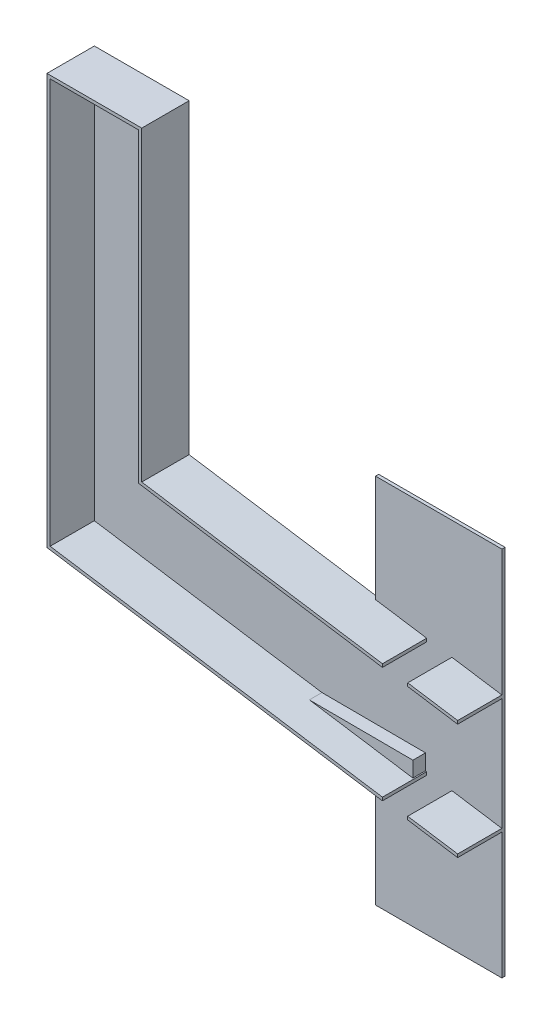
ISO-10303-21;
HEADER;
FILE_DESCRIPTION(('STEP AP214'),'2;1');
FILE_NAME('part.step','',(''),(''),'','','');
FILE_SCHEMA(('AUTOMOTIVE_DESIGN { 1 0 10303 214 1 1 1 1 }'));
ENDSEC;
DATA;
#1=APPLICATION_CONTEXT('core data for automotive mechanical design processes');
#2=APPLICATION_PROTOCOL_DEFINITION('international standard','automotive_design',2000,#1);
#3=PRODUCT_CONTEXT('',#1,'mechanical');
#4=PRODUCT('Part','Part','',(#3));
#5=PRODUCT_RELATED_PRODUCT_CATEGORY('part','',(#4));
#6=PRODUCT_DEFINITION_FORMATION('','',#4);
#7=PRODUCT_DEFINITION_CONTEXT('part definition',#1,'design');
#8=PRODUCT_DEFINITION('design','',#6,#7);
#9=PRODUCT_DEFINITION_SHAPE('','',#8);
#10=(LENGTH_UNIT() NAMED_UNIT(*) SI_UNIT(.MILLI.,.METRE.));
#11=(NAMED_UNIT(*) PLANE_ANGLE_UNIT() SI_UNIT($,.RADIAN.));
#12=(NAMED_UNIT(*) SI_UNIT($,.STERADIAN.) SOLID_ANGLE_UNIT());
#13=UNCERTAINTY_MEASURE_WITH_UNIT(LENGTH_MEASURE(1.E-05),#10,'distance_accuracy_value','');
#14=(GEOMETRIC_REPRESENTATION_CONTEXT(3) GLOBAL_UNCERTAINTY_ASSIGNED_CONTEXT((#13)) GLOBAL_UNIT_ASSIGNED_CONTEXT((#10,
#11,#12)) REPRESENTATION_CONTEXT('',''));
#15=CARTESIAN_POINT('',(0.,0.,0.));
#16=DIRECTION('',(0.,0.,1.));
#17=DIRECTION('',(1.,0.,0.));
#18=AXIS2_PLACEMENT_3D('',#15,#16,#17);
#19=CARTESIAN_POINT('',(0.,0.,5.));
#20=DIRECTION('',(0.,0.,1.));
#21=DIRECTION('',(1.,0.,0.));
#22=AXIS2_PLACEMENT_3D('',#19,#20,#21);
#23=PLANE('',#22);
#24=DIRECTION('',(0.,1.,0.));
#25=VECTOR('',#24,1.);
#26=CARTESIAN_POINT('',(105.82949898922,-15.2696962723442,5.));
#27=LINE('',#26,#25);
#28=CARTESIAN_POINT('',(105.82949898922,-10.3630488011035,5.));
#29=VERTEX_POINT('',#28);
#30=CARTESIAN_POINT('',(105.82949898922,-15.2696962723442,5.));
#31=VERTEX_POINT('',#30);
#32=EDGE_CURVE('E223',#29,#31,#27,.F.);
#33=ORIENTED_EDGE('',*,*,#32,.F.);
#34=DIRECTION('',(-0.999991329622211,0.00416421425985959,0.));
#35=VECTOR('',#34,1.);
#36=CARTESIAN_POINT('',(105.82949898922,-10.3630488011035,5.));
#37=LINE('',#36,#35);
#38=CARTESIAN_POINT('',(73.0490000969523,-10.2265425966107,5.));
#39=VERTEX_POINT('',#38);
#40=EDGE_CURVE('E230',#39,#29,#37,.F.);
#41=ORIENTED_EDGE('',*,*,#40,.F.);
#42=DIRECTION('',(-0.988371697650617,0.152057184253941,0.));
#43=VECTOR('',#42,1.);
#44=CARTESIAN_POINT('',(0.152057184253941,0.988371697650617,5.));
#45=LINE('',#44,#43);
#46=EDGE_CURVE('E243',#31,#39,#45,.T.);
#47=ORIENTED_EDGE('',*,*,#46,.F.);
#48=EDGE_LOOP('',(#33,#41,#47));
#49=FACE_BOUND('',#48,.T.);
#50=ADVANCED_FACE('F17',(#49),#23,.T.);
#51=CARTESIAN_POINT('',(114.193004161351,130.,0.));
#52=DIRECTION('',(1.,0.,0.));
#53=DIRECTION('',(0.,1.,0.));
#54=AXIS2_PLACEMENT_3D('',#51,#52,#53);
#55=PLANE('',#54);
#56=DIRECTION('',(0.,1.,0.));
#57=VECTOR('',#56,1.);
#58=CARTESIAN_POINT('',(114.193004161351,130.,1.));
#59=LINE('',#58,#57);
#60=CARTESIAN_POINT('',(114.193004161351,19.0071988301182,1.));
#61=VERTEX_POINT('',#60);
#62=CARTESIAN_POINT('',(114.193004161351,20.0189639407309,1.));
#63=VERTEX_POINT('',#62);
#64=EDGE_CURVE('E20',#61,#63,#59,.T.);
#65=ORIENTED_EDGE('',*,*,#64,.F.);
#66=DIRECTION('',(0.,0.,1.));
#67=VECTOR('',#66,1.);
#68=CARTESIAN_POINT('',(114.193004161351,19.0071988301182,15.));
#69=LINE('',#68,#67);
#70=CARTESIAN_POINT('',(114.193004161351,19.0071988301182,15.));
#71=VERTEX_POINT('',#70);
#72=EDGE_CURVE('E321',#61,#71,#69,.T.);
#73=ORIENTED_EDGE('',*,*,#72,.T.);
#74=DIRECTION('',(0.,1.,0.));
#75=VECTOR('',#74,1.);
#76=CARTESIAN_POINT('',(114.193004161351,0.,15.));
#77=LINE('',#76,#75);
#78=CARTESIAN_POINT('',(114.193004161351,20.0189639407309,15.));
#79=VERTEX_POINT('',#78);
#80=EDGE_CURVE('E257',#79,#71,#77,.F.);
#81=ORIENTED_EDGE('',*,*,#80,.F.);
#82=DIRECTION('',(0.,0.,1.));
#83=VECTOR('',#82,1.);
#84=CARTESIAN_POINT('',(114.193004161351,20.0189639407309,1.));
#85=LINE('',#84,#83);
#86=EDGE_CURVE('E277',#63,#79,#85,.T.);
#87=ORIENTED_EDGE('',*,*,#86,.F.);
#88=EDGE_LOOP('',(#65,#73,#81,#87));
#89=FACE_BOUND('',#88,.T.);
#90=ADVANCED_FACE('F278',(#89),#55,.F.);
#91=CARTESIAN_POINT('',(0.,0.,15.));
#92=DIRECTION('',(0.,0.,1.));
#93=DIRECTION('',(1.,0.,0.));
#94=AXIS2_PLACEMENT_3D('',#91,#92,#93);
#95=PLANE('',#94);
#96=DIRECTION('',(0.,1.,0.));
#97=VECTOR('',#96,1.);
#98=CARTESIAN_POINT('',(130.,0.,15.));
#99=LINE('',#98,#97);
#100=CARTESIAN_POINT('',(130.,16.5753533164798,15.));
#101=VERTEX_POINT('',#100);
#102=CARTESIAN_POINT('',(130.,17.5871184270926,15.));
#103=VERTEX_POINT('',#102);
#104=EDGE_CURVE('E256',#101,#103,#99,.T.);
#105=ORIENTED_EDGE('',*,*,#104,.T.);
#106=DIRECTION('',(-0.988371697650617,0.152057184253941,0.));
#107=VECTOR('',#106,1.);
#108=CARTESIAN_POINT('',(30.,32.9717338117079,15.));
#109=LINE('',#108,#107);
#110=EDGE_CURVE('E281',#79,#103,#109,.F.);
#111=ORIENTED_EDGE('',*,*,#110,.F.);
#112=ORIENTED_EDGE('',*,*,#80,.T.);
#113=DIRECTION('',(-0.988371697650617,0.152057184253941,0.));
#114=VECTOR('',#113,1.);
#115=CARTESIAN_POINT('',(5.49687390883511,35.7296804074282,15.));
#116=LINE('',#115,#114);
#117=EDGE_CURVE('E319',#71,#101,#116,.F.);
#118=ORIENTED_EDGE('',*,*,#117,.T.);
#119=EDGE_LOOP('',(#105,#111,#112,#118));
#120=FACE_BOUND('',#119,.T.);
#121=ADVANCED_FACE('F641',(#120),#95,.T.);
#122=CARTESIAN_POINT('',(114.193004161351,130.,0.));
#123=DIRECTION('',(1.,0.,0.));
#124=DIRECTION('',(0.,1.,0.));
#125=AXIS2_PLACEMENT_3D('',#122,#123,#124);
#126=PLANE('',#125);
#127=DIRECTION('',(0.,0.,1.));
#128=VECTOR('',#127,1.);
#129=CARTESIAN_POINT('',(114.193004161351,-16.5563893757489,15.));
#130=LINE('',#129,#128);
#131=CARTESIAN_POINT('',(114.193004161351,-16.5563893757489,1.));
#132=VERTEX_POINT('',#131);
#133=CARTESIAN_POINT('',(114.193004161351,-16.5563893757489,15.));
#134=VERTEX_POINT('',#133);
#135=EDGE_CURVE('E317',#132,#134,#130,.T.);
#136=ORIENTED_EDGE('',*,*,#135,.F.);
#137=DIRECTION('',(0.,1.,0.));
#138=VECTOR('',#137,1.);
#139=CARTESIAN_POINT('',(114.193004161351,130.,1.));
#140=LINE('',#139,#138);
#141=CARTESIAN_POINT('',(114.193004161351,-17.5681544863616,1.));
#142=VERTEX_POINT('',#141);
#143=EDGE_CURVE('E254',#142,#132,#140,.T.);
#144=ORIENTED_EDGE('',*,*,#143,.F.);
#145=DIRECTION('',(0.,0.,1.));
#146=VECTOR('',#145,1.);
#147=CARTESIAN_POINT('',(114.193004161351,-17.5681544863616,1.));
#148=LINE('',#147,#146);
#149=CARTESIAN_POINT('',(114.193004161351,-17.5681544863616,15.));
#150=VERTEX_POINT('',#149);
#151=EDGE_CURVE('E311',#142,#150,#148,.T.);
#152=ORIENTED_EDGE('',*,*,#151,.T.);
#153=DIRECTION('',(0.,1.,0.));
#154=VECTOR('',#153,1.);
#155=CARTESIAN_POINT('',(114.193004161351,0.,15.));
#156=LINE('',#155,#154);
#157=EDGE_CURVE('E252',#134,#150,#156,.F.);
#158=ORIENTED_EDGE('',*,*,#157,.F.);
#159=EDGE_LOOP('',(#136,#144,#152,#158));
#160=FACE_BOUND('',#159,.T.);
#161=ADVANCED_FACE('F637',(#160),#126,.F.);
#162=CARTESIAN_POINT('',(0.,0.,15.));
#163=DIRECTION('',(0.,0.,1.));
#164=DIRECTION('',(1.,0.,0.));
#165=AXIS2_PLACEMENT_3D('',#162,#163,#164);
#166=PLANE('',#165);
#167=DIRECTION('',(0.,1.,0.));
#168=VECTOR('',#167,1.);
#169=CARTESIAN_POINT('',(130.,0.,15.));
#170=LINE('',#169,#168);
#171=CARTESIAN_POINT('',(130.,-20.,15.));
#172=VERTEX_POINT('',#171);
#173=CARTESIAN_POINT('',(130.,-18.9882348893872,15.));
#174=VERTEX_POINT('',#173);
#175=EDGE_CURVE('E238',#172,#174,#170,.T.);
#176=ORIENTED_EDGE('',*,*,#175,.T.);
#177=DIRECTION('',(-0.988371697650617,0.152057184253941,0.));
#178=VECTOR('',#177,1.);
#179=CARTESIAN_POINT('',(0.152057184253941,0.988371697650617,15.));
#180=LINE('',#179,#178);
#181=EDGE_CURVE('E314',#134,#174,#180,.F.);
#182=ORIENTED_EDGE('',*,*,#181,.F.);
#183=ORIENTED_EDGE('',*,*,#157,.T.);
#184=DIRECTION('',(-0.988371697650617,0.152057184253941,0.));
#185=VECTOR('',#184,1.);
#186=CARTESIAN_POINT('',(0.,0.,15.));
#187=LINE('',#186,#185);
#188=EDGE_CURVE('E308',#150,#172,#187,.F.);
#189=ORIENTED_EDGE('',*,*,#188,.T.);
#190=EDGE_LOOP('',(#176,#182,#183,#189));
#191=FACE_BOUND('',#190,.T.);
#192=ADVANCED_FACE('F634',(#191),#166,.T.);
#193=CARTESIAN_POINT('',(105.82949898922,-10.3630488011035,-5.));
#194=DIRECTION('',(0.00416421425985959,0.999991329622211,0.));
#195=DIRECTION('',(-0.999991329622211,0.00416421425985959,0.));
#196=AXIS2_PLACEMENT_3D('',#193,#194,#195);
#197=PLANE('',#196);
#198=DIRECTION('',(0.,0.,-1.));
#199=VECTOR('',#198,1.);
#200=CARTESIAN_POINT('',(105.82949898922,-10.3630488011035,-5.));
#201=LINE('',#200,#199);
#202=CARTESIAN_POINT('',(105.82949898922,-10.3630488011035,1.));
#203=VERTEX_POINT('',#202);
#204=EDGE_CURVE('E233',#203,#29,#201,.F.);
#205=ORIENTED_EDGE('',*,*,#204,.F.);
#206=DIRECTION('',(0.999991329622211,-0.00416421425985969,0.));
#207=VECTOR('',#206,1.);
#208=CARTESIAN_POINT('',(73.0490000969521,-10.2265425966106,1.));
#209=LINE('',#208,#207);
#210=CARTESIAN_POINT('',(73.049000096952,-10.2265425966106,1.));
#211=VERTEX_POINT('',#210);
#212=EDGE_CURVE('E306',#211,#203,#209,.T.);
#213=ORIENTED_EDGE('',*,*,#212,.F.);
#214=DIRECTION('',(0.,0.,1.));
#215=VECTOR('',#214,1.);
#216=CARTESIAN_POINT('',(73.0490000969521,-10.2265425966106,15.));
#217=LINE('',#216,#215);
#218=EDGE_CURVE('E235',#39,#211,#217,.F.);
#219=ORIENTED_EDGE('',*,*,#218,.F.);
#220=ORIENTED_EDGE('',*,*,#40,.T.);
#221=EDGE_LOOP('',(#205,#213,#219,#220));
#222=FACE_BOUND('',#221,.T.);
#223=ADVANCED_FACE('F231',(#222),#197,.T.);
#224=CARTESIAN_POINT('',(105.82949898922,-15.2696962723442,-5.));
#225=DIRECTION('',(1.,0.,0.));
#226=DIRECTION('',(0.,0.,-1.));
#227=AXIS2_PLACEMENT_3D('',#224,#225,#226);
#228=PLANE('',#227);
#229=DIRECTION('',(0.,0.,1.));
#230=VECTOR('',#229,1.);
#231=CARTESIAN_POINT('',(105.82949898922,-15.2696962723442,15.));
#232=LINE('',#231,#230);
#233=CARTESIAN_POINT('',(105.82949898922,-15.2696962723442,0.999999999999999));
#234=VERTEX_POINT('',#233);
#235=EDGE_CURVE('E349',#234,#31,#232,.T.);
#236=ORIENTED_EDGE('',*,*,#235,.F.);
#237=DIRECTION('',(0.,1.,0.));
#238=VECTOR('',#237,1.);
#239=CARTESIAN_POINT('',(105.82949898922,0.,1.));
#240=LINE('',#239,#238);
#241=EDGE_CURVE('E241',#203,#234,#240,.F.);
#242=ORIENTED_EDGE('',*,*,#241,.F.);
#243=ORIENTED_EDGE('',*,*,#204,.T.);
#244=ORIENTED_EDGE('',*,*,#32,.T.);
#245=EDGE_LOOP('',(#236,#242,#243,#244));
#246=FACE_BOUND('',#245,.T.);
#247=ADVANCED_FACE('F240',(#246),#228,.T.);
#248=CARTESIAN_POINT('',(5.49687390883511,35.7296804074282,15.));
#249=DIRECTION('',(0.152057184253941,0.988371697650617,0.));
#250=DIRECTION('',(-0.988371697650617,0.152057184253941,0.));
#251=AXIS2_PLACEMENT_3D('',#248,#249,#250);
#252=PLANE('',#251);
#253=DIRECTION('',(0.988371697650617,-0.152057184253941,0.));
#254=VECTOR('',#253,1.);
#255=CARTESIAN_POINT('',(29.,32.1138148549413,15.));
#256=LINE('',#255,#254);
#257=CARTESIAN_POINT('',(29.,32.1138148549413,15.));
#258=VERTEX_POINT('',#257);
#259=CARTESIAN_POINT('',(106.193004161351,20.2379680608874,15.));
#260=VERTEX_POINT('',#259);
#261=EDGE_CURVE('E329',#258,#260,#256,.T.);
#262=ORIENTED_EDGE('',*,*,#261,.F.);
#263=DIRECTION('',(0.,0.,1.));
#264=VECTOR('',#263,1.);
#265=CARTESIAN_POINT('',(29.,32.1138148549413,15.));
#266=LINE('',#265,#264);
#267=CARTESIAN_POINT('',(29.,32.1138148549413,0.999999999999998));
#268=VERTEX_POINT('',#267);
#269=EDGE_CURVE('E244',#258,#268,#266,.F.);
#270=ORIENTED_EDGE('',*,*,#269,.T.);
#271=DIRECTION('',(-0.988371697650617,0.152057184253941,0.));
#272=VECTOR('',#271,1.);
#273=CARTESIAN_POINT('',(106.193004161351,20.2379680608874,1.));
#274=LINE('',#273,#272);
#275=CARTESIAN_POINT('',(106.193004161351,20.2379680608874,0.999999999999997));
#276=VERTEX_POINT('',#275);
#277=EDGE_CURVE('E291',#276,#268,#274,.T.);
#278=ORIENTED_EDGE('',*,*,#277,.F.);
#279=DIRECTION('',(0.,0.,1.));
#280=VECTOR('',#279,1.);
#281=CARTESIAN_POINT('',(106.193004161351,20.2379680608874,0.));
#282=LINE('',#281,#280);
#283=EDGE_CURVE('E343',#260,#276,#282,.F.);
#284=ORIENTED_EDGE('',*,*,#283,.F.);
#285=EDGE_LOOP('',(#262,#270,#278,#284));
#286=FACE_BOUND('',#285,.T.);
#287=ADVANCED_FACE('F377',(#286),#252,.F.);
#288=CARTESIAN_POINT('',(29.,0.,15.));
#289=DIRECTION('',(1.,0.,0.));
#290=DIRECTION('',(0.,1.,0.));
#291=AXIS2_PLACEMENT_3D('',#288,#289,#290);
#292=PLANE('',#291);
#293=ORIENTED_EDGE('',*,*,#269,.F.);
#294=DIRECTION('',(0.,1.,0.));
#295=VECTOR('',#294,1.);
#296=CARTESIAN_POINT('',(29.,0.,15.));
#297=LINE('',#296,#295);
#298=CARTESIAN_POINT('',(29.,129.,15.));
#299=VERTEX_POINT('',#298);
#300=EDGE_CURVE('E331',#299,#258,#297,.F.);
#301=ORIENTED_EDGE('',*,*,#300,.F.);
#302=DIRECTION('',(0.,0.,1.));
#303=VECTOR('',#302,1.);
#304=CARTESIAN_POINT('',(29.,129.,15.));
#305=LINE('',#304,#303);
#306=CARTESIAN_POINT('',(29.,129.,1.));
#307=VERTEX_POINT('',#306);
#308=EDGE_CURVE('E247',#299,#307,#305,.F.);
#309=ORIENTED_EDGE('',*,*,#308,.T.);
#310=DIRECTION('',(0.,1.,0.));
#311=VECTOR('',#310,1.);
#312=CARTESIAN_POINT('',(29.,0.,1.));
#313=LINE('',#312,#311);
#314=EDGE_CURVE('E359',#268,#307,#313,.T.);
#315=ORIENTED_EDGE('',*,*,#314,.F.);
#316=EDGE_LOOP('',(#293,#301,#309,#315));
#317=FACE_BOUND('',#316,.T.);
#318=ADVANCED_FACE('F358',(#317),#292,.F.);
#319=CARTESIAN_POINT('',(0.,129.,15.));
#320=DIRECTION('',(0.,1.,0.));
#321=DIRECTION('',(0.,0.,1.));
#322=AXIS2_PLACEMENT_3D('',#319,#320,#321);
#323=PLANE('',#322);
#324=ORIENTED_EDGE('',*,*,#308,.F.);
#325=DIRECTION('',(1.,0.,0.));
#326=VECTOR('',#325,1.);
#327=CARTESIAN_POINT('',(0.,129.,15.));
#328=LINE('',#327,#326);
#329=CARTESIAN_POINT('',(1.,129.,15.));
#330=VERTEX_POINT('',#329);
#331=EDGE_CURVE('E334',#330,#299,#328,.T.);
#332=ORIENTED_EDGE('',*,*,#331,.F.);
#333=DIRECTION('',(0.,0.,1.));
#334=VECTOR('',#333,1.);
#335=CARTESIAN_POINT('',(1.,129.,15.));
#336=LINE('',#335,#334);
#337=CARTESIAN_POINT('',(1.,129.,1.));
#338=VERTEX_POINT('',#337);
#339=EDGE_CURVE('E351',#330,#338,#336,.F.);
#340=ORIENTED_EDGE('',*,*,#339,.T.);
#341=DIRECTION('',(1.,0.,0.));
#342=VECTOR('',#341,1.);
#343=CARTESIAN_POINT('',(0.,129.,1.));
#344=LINE('',#343,#342);
#345=EDGE_CURVE('E362',#307,#338,#344,.F.);
#346=ORIENTED_EDGE('',*,*,#345,.F.);
#347=EDGE_LOOP('',(#324,#332,#340,#346));
#348=FACE_BOUND('',#347,.T.);
#349=ADVANCED_FACE('F363',(#348),#323,.F.);
#350=CARTESIAN_POINT('',(1.,0.,15.));
#351=DIRECTION('',(-1.,0.,0.));
#352=DIRECTION('',(0.,0.,1.));
#353=AXIS2_PLACEMENT_3D('',#350,#351,#352);
#354=PLANE('',#353);
#355=ORIENTED_EDGE('',*,*,#339,.F.);
#356=DIRECTION('',(0.,1.,0.));
#357=VECTOR('',#356,1.);
#358=CARTESIAN_POINT('',(1.,0.,15.));
#359=LINE('',#358,#357);
#360=CARTESIAN_POINT('',(1.,0.857918956766607,15.));
#361=VERTEX_POINT('',#360);
#362=EDGE_CURVE('E337',#361,#330,#359,.T.);
#363=ORIENTED_EDGE('',*,*,#362,.F.);
#364=DIRECTION('',(0.,0.,1.));
#365=VECTOR('',#364,1.);
#366=CARTESIAN_POINT('',(1.,0.857918956766607,15.));
#367=LINE('',#366,#365);
#368=CARTESIAN_POINT('',(1.,0.857918956766607,1.));
#369=VERTEX_POINT('',#368);
#370=EDGE_CURVE('E345',#369,#361,#367,.T.);
#371=ORIENTED_EDGE('',*,*,#370,.F.);
#372=DIRECTION('',(0.,1.,0.));
#373=VECTOR('',#372,1.);
#374=CARTESIAN_POINT('',(1.,0.,1.));
#375=LINE('',#374,#373);
#376=EDGE_CURVE('E365',#338,#369,#375,.F.);
#377=ORIENTED_EDGE('',*,*,#376,.F.);
#378=EDGE_LOOP('',(#355,#363,#371,#377));
#379=FACE_BOUND('',#378,.T.);
#380=ADVANCED_FACE('F385',(#379),#354,.F.);
#381=CARTESIAN_POINT('',(0.152057184253941,0.988371697650617,15.));
#382=DIRECTION('',(0.152057184253941,0.988371697650617,0.));
#383=DIRECTION('',(-0.988371697650617,0.152057184253941,0.));
#384=AXIS2_PLACEMENT_3D('',#381,#382,#383);
#385=PLANE('',#384);
#386=DIRECTION('',(0.,0.,1.));
#387=VECTOR('',#386,1.);
#388=CARTESIAN_POINT('',(106.193004161351,-15.3256201449796,0.));
#389=LINE('',#388,#387);
#390=CARTESIAN_POINT('',(106.193004161351,-15.3256201449796,0.999999999999997));
#391=VERTEX_POINT('',#390);
#392=CARTESIAN_POINT('',(106.193004161351,-15.3256201449796,15.));
#393=VERTEX_POINT('',#392);
#394=EDGE_CURVE('E325',#391,#393,#389,.T.);
#395=ORIENTED_EDGE('',*,*,#394,.F.);
#396=DIRECTION('',(0.988371697650621,-0.152057184253913,0.));
#397=VECTOR('',#396,1.);
#398=CARTESIAN_POINT('',(105.82949898922,-15.2696962723442,1.));
#399=LINE('',#398,#397);
#400=EDGE_CURVE('E303',#234,#391,#399,.T.);
#401=ORIENTED_EDGE('',*,*,#400,.F.);
#402=ORIENTED_EDGE('',*,*,#235,.T.);
#403=ORIENTED_EDGE('',*,*,#46,.T.);
#404=ORIENTED_EDGE('',*,*,#218,.T.);
#405=DIRECTION('',(0.988371697650617,-0.152057184253941,0.));
#406=VECTOR('',#405,1.);
#407=CARTESIAN_POINT('',(1.,0.857918956766607,1.));
#408=LINE('',#407,#406);
#409=EDGE_CURVE('E367',#369,#211,#408,.T.);
#410=ORIENTED_EDGE('',*,*,#409,.F.);
#411=ORIENTED_EDGE('',*,*,#370,.T.);
#412=DIRECTION('',(-0.988371697650617,0.152057184253941,0.));
#413=VECTOR('',#412,1.);
#414=CARTESIAN_POINT('',(106.193004161351,-15.3256201449796,15.));
#415=LINE('',#414,#413);
#416=EDGE_CURVE('E340',#393,#361,#415,.T.);
#417=ORIENTED_EDGE('',*,*,#416,.F.);
#418=EDGE_LOOP('',(#395,#401,#402,#403,#404,#410,#411,#417));
#419=FACE_BOUND('',#418,.T.);
#420=ADVANCED_FACE('F618',(#419),#385,.T.);
#421=CARTESIAN_POINT('',(0.,0.,-5.));
#422=DIRECTION('',(0.,0.,1.));
#423=DIRECTION('',(1.,0.,0.));
#424=AXIS2_PLACEMENT_3D('',#421,#422,#423);
#425=PLANE('',#424);
#426=DIRECTION('',(-0.999991329622211,0.00416421425985959,0.));
#427=VECTOR('',#426,1.);
#428=CARTESIAN_POINT('',(105.82949898922,-10.3630488011035,-5.));
#429=LINE('',#428,#427);
#430=CARTESIAN_POINT('',(105.82949898922,-10.3630488011035,-5.));
#431=VERTEX_POINT('',#430);
#432=CARTESIAN_POINT('',(73.0490000969522,-10.2265425966106,-5.));
#433=VERTEX_POINT('',#432);
#434=EDGE_CURVE('E399',#431,#433,#429,.T.);
#435=ORIENTED_EDGE('',*,*,#434,.F.);
#436=DIRECTION('',(0.,1.,0.));
#437=VECTOR('',#436,1.);
#438=CARTESIAN_POINT('',(105.82949898922,-15.2696962723442,-5.));
#439=LINE('',#438,#437);
#440=CARTESIAN_POINT('',(105.82949898922,-15.2696962723442,-5.));
#441=VERTEX_POINT('',#440);
#442=EDGE_CURVE('E389',#441,#431,#439,.T.);
#443=ORIENTED_EDGE('',*,*,#442,.F.);
#444=DIRECTION('',(0.988371697650617,-0.152057184253941,0.));
#445=VECTOR('',#444,1.);
#446=CARTESIAN_POINT('',(73.0490000969521,-10.2265425966106,-5.));
#447=LINE('',#446,#445);
#448=EDGE_CURVE('E390',#433,#441,#447,.T.);
#449=ORIENTED_EDGE('',*,*,#448,.F.);
#450=EDGE_LOOP('',(#435,#443,#449));
#451=FACE_BOUND('',#450,.T.);
#452=ADVANCED_FACE('F614',(#451),#425,.F.);
#453=CARTESIAN_POINT('',(106.193004161351,130.,0.));
#454=DIRECTION('',(1.,0.,0.));
#455=DIRECTION('',(0.,1.,0.));
#456=AXIS2_PLACEMENT_3D('',#453,#454,#455);
#457=PLANE('',#456);
#458=DIRECTION('',(0.,1.,0.));
#459=VECTOR('',#458,1.);
#460=CARTESIAN_POINT('',(106.193004161351,0.,1.));
#461=LINE('',#460,#459);
#462=CARTESIAN_POINT('',(106.193004161351,21.2497331715002,0.999999999999997));
#463=VERTEX_POINT('',#462);
#464=EDGE_CURVE('E288',#463,#276,#461,.F.);
#465=ORIENTED_EDGE('',*,*,#464,.F.);
#466=DIRECTION('',(0.,0.,1.));
#467=VECTOR('',#466,1.);
#468=CARTESIAN_POINT('',(106.193004161351,21.2497331715002,1.));
#469=LINE('',#468,#467);
#470=CARTESIAN_POINT('',(106.193004161351,21.2497331715002,15.));
#471=VERTEX_POINT('',#470);
#472=EDGE_CURVE('E414',#471,#463,#469,.F.);
#473=ORIENTED_EDGE('',*,*,#472,.F.);
#474=DIRECTION('',(0.,1.,0.));
#475=VECTOR('',#474,1.);
#476=CARTESIAN_POINT('',(106.193004161351,0.,15.));
#477=LINE('',#476,#475);
#478=EDGE_CURVE('E327',#260,#471,#477,.T.);
#479=ORIENTED_EDGE('',*,*,#478,.F.);
#480=ORIENTED_EDGE('',*,*,#283,.T.);
#481=EDGE_LOOP('',(#465,#473,#479,#480));
#482=FACE_BOUND('',#481,.T.);
#483=ADVANCED_FACE('F611',(#482),#457,.T.);
#484=CARTESIAN_POINT('',(0.,0.,15.));
#485=DIRECTION('',(0.,0.,1.));
#486=DIRECTION('',(1.,0.,0.));
#487=AXIS2_PLACEMENT_3D('',#484,#485,#486);
#488=PLANE('',#487);
#489=DIRECTION('',(0.,1.,0.));
#490=VECTOR('',#489,1.);
#491=CARTESIAN_POINT('',(0.,0.,15.));
#492=LINE('',#491,#490);
#493=CARTESIAN_POINT('',(0.,0.,15.));
#494=VERTEX_POINT('',#493);
#495=CARTESIAN_POINT('',(0.,130.,15.));
#496=VERTEX_POINT('',#495);
#497=EDGE_CURVE('E428',#494,#496,#492,.T.);
#498=ORIENTED_EDGE('',*,*,#497,.F.);
#499=DIRECTION('',(-0.988371697650617,0.152057184253941,0.));
#500=VECTOR('',#499,1.);
#501=CARTESIAN_POINT('',(0.,0.,15.));
#502=LINE('',#501,#500);
#503=CARTESIAN_POINT('',(106.193004161351,-16.3373852555924,15.));
#504=VERTEX_POINT('',#503);
#505=EDGE_CURVE('E438',#494,#504,#502,.F.);
#506=ORIENTED_EDGE('',*,*,#505,.T.);
#507=DIRECTION('',(0.,1.,0.));
#508=VECTOR('',#507,1.);
#509=CARTESIAN_POINT('',(106.193004161351,130.,15.));
#510=LINE('',#509,#508);
#511=EDGE_CURVE('E282',#393,#504,#510,.F.);
#512=ORIENTED_EDGE('',*,*,#511,.F.);
#513=ORIENTED_EDGE('',*,*,#416,.T.);
#514=ORIENTED_EDGE('',*,*,#362,.T.);
#515=ORIENTED_EDGE('',*,*,#331,.T.);
#516=ORIENTED_EDGE('',*,*,#300,.T.);
#517=ORIENTED_EDGE('',*,*,#261,.T.);
#518=ORIENTED_EDGE('',*,*,#478,.T.);
#519=DIRECTION('',(-0.988371697650617,0.152057184253941,0.));
#520=VECTOR('',#519,1.);
#521=CARTESIAN_POINT('',(30.,32.9717338117079,15.));
#522=LINE('',#521,#520);
#523=CARTESIAN_POINT('',(30.,32.9717338117079,15.));
#524=VERTEX_POINT('',#523);
#525=EDGE_CURVE('E411',#524,#471,#522,.F.);
#526=ORIENTED_EDGE('',*,*,#525,.F.);
#527=DIRECTION('',(0.,1.,0.));
#528=VECTOR('',#527,1.);
#529=CARTESIAN_POINT('',(30.,130.,15.));
#530=LINE('',#529,#528);
#531=CARTESIAN_POINT('',(30.,130.,15.));
#532=VERTEX_POINT('',#531);
#533=EDGE_CURVE('E420',#532,#524,#530,.F.);
#534=ORIENTED_EDGE('',*,*,#533,.F.);
#535=DIRECTION('',(1.,0.,0.));
#536=VECTOR('',#535,1.);
#537=CARTESIAN_POINT('',(0.,130.,15.));
#538=LINE('',#537,#536);
#539=EDGE_CURVE('E424',#496,#532,#538,.T.);
#540=ORIENTED_EDGE('',*,*,#539,.F.);
#541=EDGE_LOOP('',(#498,#506,#512,#513,#514,#515,#516,#517,#518,#526,#534,#540));
#542=FACE_BOUND('',#541,.T.);
#543=ADVANCED_FACE('F379',(#542),#488,.T.);
#544=CARTESIAN_POINT('',(106.193004161351,130.,0.));
#545=DIRECTION('',(1.,0.,0.));
#546=DIRECTION('',(0.,1.,0.));
#547=AXIS2_PLACEMENT_3D('',#544,#545,#546);
#548=PLANE('',#547);
#549=ORIENTED_EDGE('',*,*,#394,.T.);
#550=ORIENTED_EDGE('',*,*,#511,.T.);
#551=DIRECTION('',(0.,0.,1.));
#552=VECTOR('',#551,1.);
#553=CARTESIAN_POINT('',(106.193004161351,-16.3373852555924,1.));
#554=LINE('',#553,#552);
#555=CARTESIAN_POINT('',(106.193004161351,-16.3373852555924,0.999999999999998));
#556=VERTEX_POINT('',#555);
#557=EDGE_CURVE('E441',#504,#556,#554,.F.);
#558=ORIENTED_EDGE('',*,*,#557,.T.);
#559=DIRECTION('',(0.,1.,0.));
#560=VECTOR('',#559,1.);
#561=CARTESIAN_POINT('',(106.193004161351,0.,1.));
#562=LINE('',#561,#560);
#563=EDGE_CURVE('E301',#391,#556,#562,.F.);
#564=ORIENTED_EDGE('',*,*,#563,.F.);
#565=EDGE_LOOP('',(#549,#550,#558,#564));
#566=FACE_BOUND('',#565,.T.);
#567=ADVANCED_FACE('F605',(#566),#548,.T.);
#568=CARTESIAN_POINT('',(30.,32.9717338117079,1.));
#569=DIRECTION('',(0.152057184253941,0.988371697650617,0.));
#570=DIRECTION('',(-0.988371697650617,0.152057184253941,0.));
#571=AXIS2_PLACEMENT_3D('',#568,#569,#570);
#572=PLANE('',#571);
#573=DIRECTION('',(0.,0.,-1.));
#574=VECTOR('',#573,1.);
#575=CARTESIAN_POINT('',(130.,17.5871184270926,1.));
#576=LINE('',#575,#574);
#577=CARTESIAN_POINT('',(130.,17.5871184270926,1.));
#578=VERTEX_POINT('',#577);
#579=EDGE_CURVE('E287',#578,#103,#576,.F.);
#580=ORIENTED_EDGE('',*,*,#579,.F.);
#581=DIRECTION('',(0.988371697650617,-0.152057184253942,0.));
#582=VECTOR('',#581,1.);
#583=CARTESIAN_POINT('',(114.193004161351,20.0189639407309,1.));
#584=LINE('',#583,#582);
#585=EDGE_CURVE('E269',#63,#578,#584,.T.);
#586=ORIENTED_EDGE('',*,*,#585,.F.);
#587=ORIENTED_EDGE('',*,*,#86,.T.);
#588=ORIENTED_EDGE('',*,*,#110,.T.);
#589=EDGE_LOOP('',(#580,#586,#587,#588));
#590=FACE_BOUND('',#589,.T.);
#591=ADVANCED_FACE('F285',(#590),#572,.T.);
#592=CARTESIAN_POINT('',(5.49687390883511,35.7296804074282,15.));
#593=DIRECTION('',(0.152057184253941,0.988371697650617,0.));
#594=DIRECTION('',(-0.988371697650617,0.152057184253941,0.));
#595=AXIS2_PLACEMENT_3D('',#592,#593,#594);
#596=PLANE('',#595);
#597=ORIENTED_EDGE('',*,*,#72,.F.);
#598=DIRECTION('',(-0.988371697650617,0.152057184253941,0.));
#599=VECTOR('',#598,1.);
#600=CARTESIAN_POINT('',(130.,16.5753533164798,1.));
#601=LINE('',#600,#599);
#602=CARTESIAN_POINT('',(130.,16.5753533164798,1.));
#603=VERTEX_POINT('',#602);
#604=EDGE_CURVE('E273',#603,#61,#601,.T.);
#605=ORIENTED_EDGE('',*,*,#604,.F.);
#606=DIRECTION('',(0.,0.,-1.));
#607=VECTOR('',#606,1.);
#608=CARTESIAN_POINT('',(130.,16.5753533164798,1.));
#609=LINE('',#608,#607);
#610=EDGE_CURVE('E455',#101,#603,#609,.T.);
#611=ORIENTED_EDGE('',*,*,#610,.F.);
#612=ORIENTED_EDGE('',*,*,#117,.F.);
#613=EDGE_LOOP('',(#597,#605,#611,#612));
#614=FACE_BOUND('',#613,.T.);
#615=ADVANCED_FACE('F598',(#614),#596,.F.);
#616=CARTESIAN_POINT('',(0.152057184253941,0.988371697650617,15.));
#617=DIRECTION('',(0.152057184253941,0.988371697650617,0.));
#618=DIRECTION('',(-0.988371697650617,0.152057184253941,0.));
#619=AXIS2_PLACEMENT_3D('',#616,#617,#618);
#620=PLANE('',#619);
#621=DIRECTION('',(0.,0.,-1.));
#622=VECTOR('',#621,1.);
#623=CARTESIAN_POINT('',(130.,-18.9882348893872,1.));
#624=LINE('',#623,#622);
#625=CARTESIAN_POINT('',(130.,-18.9882348893872,1.));
#626=VERTEX_POINT('',#625);
#627=EDGE_CURVE('E460',#626,#174,#624,.F.);
#628=ORIENTED_EDGE('',*,*,#627,.F.);
#629=DIRECTION('',(0.988371697650617,-0.152057184253942,0.));
#630=VECTOR('',#629,1.);
#631=CARTESIAN_POINT('',(114.193004161351,-16.5563893757489,1.));
#632=LINE('',#631,#630);
#633=EDGE_CURVE('E293',#132,#626,#632,.T.);
#634=ORIENTED_EDGE('',*,*,#633,.F.);
#635=ORIENTED_EDGE('',*,*,#135,.T.);
#636=ORIENTED_EDGE('',*,*,#181,.T.);
#637=EDGE_LOOP('',(#628,#634,#635,#636));
#638=FACE_BOUND('',#637,.T.);
#639=ADVANCED_FACE('F594',(#638),#620,.T.);
#640=CARTESIAN_POINT('',(0.,0.,1.));
#641=DIRECTION('',(0.152057184253941,0.988371697650617,0.));
#642=DIRECTION('',(-0.988371697650617,0.152057184253941,0.));
#643=AXIS2_PLACEMENT_3D('',#640,#641,#642);
#644=PLANE('',#643);
#645=ORIENTED_EDGE('',*,*,#151,.F.);
#646=DIRECTION('',(-0.988371697650617,0.152057184253941,0.));
#647=VECTOR('',#646,1.);
#648=CARTESIAN_POINT('',(130.,-20.,1.));
#649=LINE('',#648,#647);
#650=CARTESIAN_POINT('',(130.,-20.,1.));
#651=VERTEX_POINT('',#650);
#652=EDGE_CURVE('E298',#651,#142,#649,.T.);
#653=ORIENTED_EDGE('',*,*,#652,.F.);
#654=DIRECTION('',(0.,0.,-1.));
#655=VECTOR('',#654,1.);
#656=CARTESIAN_POINT('',(130.,-20.,1.));
#657=LINE('',#656,#655);
#658=EDGE_CURVE('E463',#172,#651,#657,.T.);
#659=ORIENTED_EDGE('',*,*,#658,.F.);
#660=ORIENTED_EDGE('',*,*,#188,.F.);
#661=EDGE_LOOP('',(#645,#653,#659,#660));
#662=FACE_BOUND('',#661,.T.);
#663=ADVANCED_FACE('F591',(#662),#644,.F.);
#664=CARTESIAN_POINT('',(0.,0.,1.));
#665=DIRECTION('',(0.,0.,1.));
#666=DIRECTION('',(1.,0.,0.));
#667=AXIS2_PLACEMENT_3D('',#664,#665,#666);
#668=PLANE('',#667);
#669=ORIENTED_EDGE('',*,*,#376,.T.);
#670=ORIENTED_EDGE('',*,*,#409,.T.);
#671=ORIENTED_EDGE('',*,*,#212,.T.);
#672=ORIENTED_EDGE('',*,*,#241,.T.);
#673=ORIENTED_EDGE('',*,*,#400,.T.);
#674=ORIENTED_EDGE('',*,*,#563,.T.);
#675=DIRECTION('',(-0.988371697650617,0.152057184253941,0.));
#676=VECTOR('',#675,1.);
#677=CARTESIAN_POINT('',(0.,0.,0.999999999999996));
#678=LINE('',#677,#676);
#679=CARTESIAN_POINT('',(90.,-13.8461538461538,0.999999999999999));
#680=VERTEX_POINT('',#679);
#681=EDGE_CURVE('E432',#556,#680,#678,.T.);
#682=ORIENTED_EDGE('',*,*,#681,.T.);
#683=DIRECTION('',(0.,1.,0.));
#684=VECTOR('',#683,1.);
#685=CARTESIAN_POINT('',(90.,0.,1.));
#686=LINE('',#685,#684);
#687=CARTESIAN_POINT('',(90.,-60.,1.));
#688=VERTEX_POINT('',#687);
#689=EDGE_CURVE('E444',#688,#680,#686,.T.);
#690=ORIENTED_EDGE('',*,*,#689,.F.);
#691=DIRECTION('',(1.,0.,0.));
#692=VECTOR('',#691,1.);
#693=CARTESIAN_POINT('',(0.,-60.,1.));
#694=LINE('',#693,#692);
#695=CARTESIAN_POINT('',(130.,-60.,1.));
#696=VERTEX_POINT('',#695);
#697=EDGE_CURVE('E448',#696,#688,#694,.F.);
#698=ORIENTED_EDGE('',*,*,#697,.F.);
#699=DIRECTION('',(0.,1.,0.));
#700=VECTOR('',#699,1.);
#701=CARTESIAN_POINT('',(130.,0.,1.));
#702=LINE('',#701,#700);
#703=EDGE_CURVE('E465',#651,#696,#702,.F.);
#704=ORIENTED_EDGE('',*,*,#703,.F.);
#705=ORIENTED_EDGE('',*,*,#652,.T.);
#706=ORIENTED_EDGE('',*,*,#143,.T.);
#707=ORIENTED_EDGE('',*,*,#633,.T.);
#708=DIRECTION('',(0.,1.,0.));
#709=VECTOR('',#708,1.);
#710=CARTESIAN_POINT('',(130.,0.,1.));
#711=LINE('',#710,#709);
#712=EDGE_CURVE('E457',#603,#626,#711,.F.);
#713=ORIENTED_EDGE('',*,*,#712,.F.);
#714=ORIENTED_EDGE('',*,*,#604,.T.);
#715=ORIENTED_EDGE('',*,*,#64,.T.);
#716=ORIENTED_EDGE('',*,*,#585,.T.);
#717=DIRECTION('',(0.,1.,0.));
#718=VECTOR('',#717,1.);
#719=CARTESIAN_POINT('',(130.,0.,1.));
#720=LINE('',#719,#718);
#721=CARTESIAN_POINT('',(130.,57.5871184270926,1.));
#722=VERTEX_POINT('',#721);
#723=EDGE_CURVE('E452',#722,#578,#720,.F.);
#724=ORIENTED_EDGE('',*,*,#723,.F.);
#725=DIRECTION('',(1.,0.,0.));
#726=VECTOR('',#725,1.);
#727=CARTESIAN_POINT('',(0.,57.5871184270925,1.));
#728=LINE('',#727,#726);
#729=CARTESIAN_POINT('',(90.,57.5871184270925,1.));
#730=VERTEX_POINT('',#729);
#731=EDGE_CURVE('E403',#722,#730,#728,.F.);
#732=ORIENTED_EDGE('',*,*,#731,.T.);
#733=DIRECTION('',(0.,1.,0.));
#734=VECTOR('',#733,1.);
#735=CARTESIAN_POINT('',(90.,0.,1.));
#736=LINE('',#735,#734);
#737=CARTESIAN_POINT('',(90.,23.7409645809387,0.999999999999999));
#738=VERTEX_POINT('',#737);
#739=EDGE_CURVE('E408',#730,#738,#736,.F.);
#740=ORIENTED_EDGE('',*,*,#739,.T.);
#741=DIRECTION('',(-0.988371697650617,0.152057184253941,0.));
#742=VECTOR('',#741,1.);
#743=CARTESIAN_POINT('',(30.,32.9717338117079,0.999999999999996));
#744=LINE('',#743,#742);
#745=EDGE_CURVE('E416',#463,#738,#744,.T.);
#746=ORIENTED_EDGE('',*,*,#745,.F.);
#747=ORIENTED_EDGE('',*,*,#464,.T.);
#748=ORIENTED_EDGE('',*,*,#277,.T.);
#749=ORIENTED_EDGE('',*,*,#314,.T.);
#750=ORIENTED_EDGE('',*,*,#345,.T.);
#751=EDGE_LOOP('',(#669,#670,#671,#672,#673,#674,#682,#690,#698,#704,#705,#706,#707,#713,#714,
#715,#716,#724,#732,#740,#746,#747,#748,#749,#750));
#752=FACE_BOUND('',#751,.T.);
#753=ADVANCED_FACE('F266',(#752),#668,.T.);
#754=CARTESIAN_POINT('',(105.82949898922,-15.2696962723442,-5.));
#755=DIRECTION('',(1.,0.,0.));
#756=DIRECTION('',(0.,0.,-1.));
#757=AXIS2_PLACEMENT_3D('',#754,#755,#756);
#758=PLANE('',#757);
#759=ORIENTED_EDGE('',*,*,#442,.T.);
#760=DIRECTION('',(0.,0.,1.));
#761=VECTOR('',#760,1.);
#762=CARTESIAN_POINT('',(105.82949898922,-10.3630488011035,-5.));
#763=LINE('',#762,#761);
#764=CARTESIAN_POINT('',(105.82949898922,-10.3630488011035,0.));
#765=VERTEX_POINT('',#764);
#766=EDGE_CURVE('E396',#765,#431,#763,.F.);
#767=ORIENTED_EDGE('',*,*,#766,.F.);
#768=DIRECTION('',(0.,1.,0.));
#769=VECTOR('',#768,1.);
#770=CARTESIAN_POINT('',(105.82949898922,0.,0.));
#771=LINE('',#770,#769);
#772=CARTESIAN_POINT('',(105.82949898922,-15.2696962723442,0.));
#773=VERTEX_POINT('',#772);
#774=EDGE_CURVE('E471',#765,#773,#771,.F.);
#775=ORIENTED_EDGE('',*,*,#774,.T.);
#776=DIRECTION('',(0.,0.,1.));
#777=VECTOR('',#776,1.);
#778=CARTESIAN_POINT('',(105.82949898922,-15.2696962723442,-5.));
#779=LINE('',#778,#777);
#780=EDGE_CURVE('E394',#441,#773,#779,.T.);
#781=ORIENTED_EDGE('',*,*,#780,.F.);
#782=EDGE_LOOP('',(#759,#767,#775,#781));
#783=FACE_BOUND('',#782,.T.);
#784=ADVANCED_FACE('F584',(#783),#758,.T.);
#785=CARTESIAN_POINT('',(73.0490000969521,-10.2265425966106,-5.));
#786=DIRECTION('',(-0.152057184253941,-0.988371697650617,0.));
#787=DIRECTION('',(0.988371697650617,-0.152057184253941,0.));
#788=AXIS2_PLACEMENT_3D('',#785,#786,#787);
#789=PLANE('',#788);
#790=ORIENTED_EDGE('',*,*,#448,.T.);
#791=ORIENTED_EDGE('',*,*,#780,.T.);
#792=DIRECTION('',(-0.988371697650617,0.152057184253941,0.));
#793=VECTOR('',#792,1.);
#794=CARTESIAN_POINT('',(105.82949898922,-15.2696962723442,0.));
#795=LINE('',#794,#793);
#796=CARTESIAN_POINT('',(73.0490000969521,-10.2265425966106,0.));
#797=VERTEX_POINT('',#796);
#798=EDGE_CURVE('E474',#773,#797,#795,.T.);
#799=ORIENTED_EDGE('',*,*,#798,.T.);
#800=DIRECTION('',(0.,0.,1.));
#801=VECTOR('',#800,1.);
#802=CARTESIAN_POINT('',(73.0490000969521,-10.2265425966106,-5.));
#803=LINE('',#802,#801);
#804=EDGE_CURVE('E401',#433,#797,#803,.T.);
#805=ORIENTED_EDGE('',*,*,#804,.F.);
#806=EDGE_LOOP('',(#790,#791,#799,#805));
#807=FACE_BOUND('',#806,.T.);
#808=ADVANCED_FACE('F580',(#807),#789,.T.);
#809=CARTESIAN_POINT('',(105.82949898922,-10.3630488011035,-5.));
#810=DIRECTION('',(0.00416421425985959,0.999991329622211,0.));
#811=DIRECTION('',(-0.999991329622211,0.00416421425985959,0.));
#812=AXIS2_PLACEMENT_3D('',#809,#810,#811);
#813=PLANE('',#812);
#814=ORIENTED_EDGE('',*,*,#434,.T.);
#815=ORIENTED_EDGE('',*,*,#804,.T.);
#816=DIRECTION('',(0.999991329622211,-0.00416421425985959,0.));
#817=VECTOR('',#816,1.);
#818=CARTESIAN_POINT('',(73.0490000969521,-10.2265425966106,0.));
#819=LINE('',#818,#817);
#820=EDGE_CURVE('E477',#797,#765,#819,.T.);
#821=ORIENTED_EDGE('',*,*,#820,.T.);
#822=ORIENTED_EDGE('',*,*,#766,.T.);
#823=EDGE_LOOP('',(#814,#815,#821,#822));
#824=FACE_BOUND('',#823,.T.);
#825=ADVANCED_FACE('F577',(#824),#813,.T.);
#826=CARTESIAN_POINT('',(0.,57.5871184270925,1.));
#827=DIRECTION('',(0.,-1.,0.));
#828=DIRECTION('',(1.,0.,0.));
#829=AXIS2_PLACEMENT_3D('',#826,#827,#828);
#830=PLANE('',#829);
#831=DIRECTION('',(0.,0.,-1.));
#832=VECTOR('',#831,1.);
#833=CARTESIAN_POINT('',(90.,57.5871184270925,1.));
#834=LINE('',#833,#832);
#835=CARTESIAN_POINT('',(90.,57.5871184270925,0.));
#836=VERTEX_POINT('',#835);
#837=EDGE_CURVE('E405',#836,#730,#834,.F.);
#838=ORIENTED_EDGE('',*,*,#837,.T.);
#839=ORIENTED_EDGE('',*,*,#731,.F.);
#840=DIRECTION('',(0.,0.,-1.));
#841=VECTOR('',#840,1.);
#842=CARTESIAN_POINT('',(130.,57.5871184270926,1.));
#843=LINE('',#842,#841);
#844=CARTESIAN_POINT('',(130.,57.5871184270926,0.));
#845=VERTEX_POINT('',#844);
#846=EDGE_CURVE('E468',#845,#722,#843,.F.);
#847=ORIENTED_EDGE('',*,*,#846,.F.);
#848=DIRECTION('',(1.,0.,0.));
#849=VECTOR('',#848,1.);
#850=CARTESIAN_POINT('',(0.,57.5871184270926,0.));
#851=LINE('',#850,#849);
#852=EDGE_CURVE('E480',#845,#836,#851,.F.);
#853=ORIENTED_EDGE('',*,*,#852,.T.);
#854=EDGE_LOOP('',(#838,#839,#847,#853));
#855=FACE_BOUND('',#854,.T.);
#856=ADVANCED_FACE('F548',(#855),#830,.F.);
#857=CARTESIAN_POINT('',(90.,0.,1.));
#858=DIRECTION('',(1.,0.,0.));
#859=DIRECTION('',(0.,0.,-1.));
#860=AXIS2_PLACEMENT_3D('',#857,#858,#859);
#861=PLANE('',#860);
#862=DIRECTION('',(0.,0.,1.));
#863=VECTOR('',#862,1.);
#864=CARTESIAN_POINT('',(90.,23.7409645809387,1.));
#865=LINE('',#864,#863);
#866=CARTESIAN_POINT('',(90.,23.7409645809387,0.));
#867=VERTEX_POINT('',#866);
#868=EDGE_CURVE('E418',#738,#867,#865,.F.);
#869=ORIENTED_EDGE('',*,*,#868,.F.);
#870=ORIENTED_EDGE('',*,*,#739,.F.);
#871=ORIENTED_EDGE('',*,*,#837,.F.);
#872=DIRECTION('',(0.,1.,0.));
#873=VECTOR('',#872,1.);
#874=CARTESIAN_POINT('',(90.,0.,0.));
#875=LINE('',#874,#873);
#876=EDGE_CURVE('E483',#836,#867,#875,.F.);
#877=ORIENTED_EDGE('',*,*,#876,.T.);
#878=EDGE_LOOP('',(#869,#870,#871,#877));
#879=FACE_BOUND('',#878,.T.);
#880=ADVANCED_FACE('F545',(#879),#861,.F.);
#881=CARTESIAN_POINT('',(30.,32.9717338117079,1.));
#882=DIRECTION('',(0.152057184253941,0.988371697650617,0.));
#883=DIRECTION('',(-0.988371697650617,0.152057184253941,0.));
#884=AXIS2_PLACEMENT_3D('',#881,#882,#883);
#885=PLANE('',#884);
#886=DIRECTION('',(-0.988371697650617,0.152057184253941,0.));
#887=VECTOR('',#886,1.);
#888=CARTESIAN_POINT('',(90.,23.7409645809387,0.));
#889=LINE('',#888,#887);
#890=CARTESIAN_POINT('',(30.,32.9717338117079,0.));
#891=VERTEX_POINT('',#890);
#892=EDGE_CURVE('E486',#867,#891,#889,.T.);
#893=ORIENTED_EDGE('',*,*,#892,.T.);
#894=DIRECTION('',(0.,0.,1.));
#895=VECTOR('',#894,1.);
#896=CARTESIAN_POINT('',(30.,32.9717338117079,1.));
#897=LINE('',#896,#895);
#898=EDGE_CURVE('E422',#524,#891,#897,.F.);
#899=ORIENTED_EDGE('',*,*,#898,.F.);
#900=ORIENTED_EDGE('',*,*,#525,.T.);
#901=ORIENTED_EDGE('',*,*,#472,.T.);
#902=ORIENTED_EDGE('',*,*,#745,.T.);
#903=ORIENTED_EDGE('',*,*,#868,.T.);
#904=EDGE_LOOP('',(#893,#899,#900,#901,#902,#903));
#905=FACE_BOUND('',#904,.T.);
#906=ADVANCED_FACE('F540',(#905),#885,.T.);
#907=CARTESIAN_POINT('',(30.,130.,1.));
#908=DIRECTION('',(1.,0.,0.));
#909=DIRECTION('',(0.,1.,0.));
#910=AXIS2_PLACEMENT_3D('',#907,#908,#909);
#911=PLANE('',#910);
#912=ORIENTED_EDGE('',*,*,#533,.T.);
#913=ORIENTED_EDGE('',*,*,#898,.T.);
#914=DIRECTION('',(0.,1.,0.));
#915=VECTOR('',#914,1.);
#916=CARTESIAN_POINT('',(30.,0.,0.));
#917=LINE('',#916,#915);
#918=CARTESIAN_POINT('',(30.,130.,0.));
#919=VERTEX_POINT('',#918);
#920=EDGE_CURVE('E489',#891,#919,#917,.T.);
#921=ORIENTED_EDGE('',*,*,#920,.T.);
#922=DIRECTION('',(0.,0.,1.));
#923=VECTOR('',#922,1.);
#924=CARTESIAN_POINT('',(30.,130.,1.));
#925=LINE('',#924,#923);
#926=EDGE_CURVE('E426',#532,#919,#925,.F.);
#927=ORIENTED_EDGE('',*,*,#926,.F.);
#928=EDGE_LOOP('',(#912,#913,#921,#927));
#929=FACE_BOUND('',#928,.T.);
#930=ADVANCED_FACE('F536',(#929),#911,.T.);
#931=CARTESIAN_POINT('',(0.,130.,1.));
#932=DIRECTION('',(0.,1.,0.));
#933=DIRECTION('',(0.,0.,1.));
#934=AXIS2_PLACEMENT_3D('',#931,#932,#933);
#935=PLANE('',#934);
#936=ORIENTED_EDGE('',*,*,#539,.T.);
#937=ORIENTED_EDGE('',*,*,#926,.T.);
#938=DIRECTION('',(1.,0.,0.));
#939=VECTOR('',#938,1.);
#940=CARTESIAN_POINT('',(0.,130.,0.));
#941=LINE('',#940,#939);
#942=CARTESIAN_POINT('',(0.,130.,0.));
#943=VERTEX_POINT('',#942);
#944=EDGE_CURVE('E492',#919,#943,#941,.F.);
#945=ORIENTED_EDGE('',*,*,#944,.T.);
#946=DIRECTION('',(0.,0.,1.));
#947=VECTOR('',#946,1.);
#948=CARTESIAN_POINT('',(0.,130.,1.));
#949=LINE('',#948,#947);
#950=EDGE_CURVE('E430',#496,#943,#949,.F.);
#951=ORIENTED_EDGE('',*,*,#950,.F.);
#952=EDGE_LOOP('',(#936,#937,#945,#951));
#953=FACE_BOUND('',#952,.T.);
#954=ADVANCED_FACE('F530',(#953),#935,.T.);
#955=CARTESIAN_POINT('',(0.,0.,1.));
#956=DIRECTION('',(-1.,0.,0.));
#957=DIRECTION('',(0.,0.,1.));
#958=AXIS2_PLACEMENT_3D('',#955,#956,#957);
#959=PLANE('',#958);
#960=ORIENTED_EDGE('',*,*,#497,.T.);
#961=ORIENTED_EDGE('',*,*,#950,.T.);
#962=DIRECTION('',(0.,1.,0.));
#963=VECTOR('',#962,1.);
#964=CARTESIAN_POINT('',(0.,0.,0.));
#965=LINE('',#964,#963);
#966=CARTESIAN_POINT('',(0.,0.,0.));
#967=VERTEX_POINT('',#966);
#968=EDGE_CURVE('E495',#943,#967,#965,.F.);
#969=ORIENTED_EDGE('',*,*,#968,.T.);
#970=DIRECTION('',(0.,0.,1.));
#971=VECTOR('',#970,1.);
#972=CARTESIAN_POINT('',(0.,0.,1.));
#973=LINE('',#972,#971);
#974=EDGE_CURVE('E435',#967,#494,#973,.T.);
#975=ORIENTED_EDGE('',*,*,#974,.T.);
#976=EDGE_LOOP('',(#960,#961,#969,#975));
#977=FACE_BOUND('',#976,.T.);
#978=ADVANCED_FACE('F526',(#977),#959,.T.);
#979=CARTESIAN_POINT('',(0.,0.,1.));
#980=DIRECTION('',(0.152057184253941,0.988371697650617,0.));
#981=DIRECTION('',(-0.988371697650617,0.152057184253941,0.));
#982=AXIS2_PLACEMENT_3D('',#979,#980,#981);
#983=PLANE('',#982);
#984=ORIENTED_EDGE('',*,*,#505,.F.);
#985=ORIENTED_EDGE('',*,*,#974,.F.);
#986=DIRECTION('',(0.988371697650617,-0.152057184253941,0.));
#987=VECTOR('',#986,1.);
#988=CARTESIAN_POINT('',(0.,0.,0.));
#989=LINE('',#988,#987);
#990=CARTESIAN_POINT('',(90.,-13.8461538461538,0.));
#991=VERTEX_POINT('',#990);
#992=EDGE_CURVE('E498',#967,#991,#989,.T.);
#993=ORIENTED_EDGE('',*,*,#992,.T.);
#994=DIRECTION('',(0.,0.,1.));
#995=VECTOR('',#994,1.);
#996=CARTESIAN_POINT('',(90.,-13.8461538461538,1.));
#997=LINE('',#996,#995);
#998=EDGE_CURVE('E446',#680,#991,#997,.F.);
#999=ORIENTED_EDGE('',*,*,#998,.F.);
#1000=ORIENTED_EDGE('',*,*,#681,.F.);
#1001=ORIENTED_EDGE('',*,*,#557,.F.);
#1002=EDGE_LOOP('',(#984,#985,#993,#999,#1000,#1001));
#1003=FACE_BOUND('',#1002,.T.);
#1004=ADVANCED_FACE('F521',(#1003),#983,.F.);
#1005=CARTESIAN_POINT('',(90.,0.,1.));
#1006=DIRECTION('',(-1.,0.,0.));
#1007=DIRECTION('',(0.,0.,1.));
#1008=AXIS2_PLACEMENT_3D('',#1005,#1006,#1007);
#1009=PLANE('',#1008);
#1010=ORIENTED_EDGE('',*,*,#689,.T.);
#1011=ORIENTED_EDGE('',*,*,#998,.T.);
#1012=DIRECTION('',(0.,1.,0.));
#1013=VECTOR('',#1012,1.);
#1014=CARTESIAN_POINT('',(90.,0.,0.));
#1015=LINE('',#1014,#1013);
#1016=CARTESIAN_POINT('',(90.,-60.,0.));
#1017=VERTEX_POINT('',#1016);
#1018=EDGE_CURVE('E501',#991,#1017,#1015,.F.);
#1019=ORIENTED_EDGE('',*,*,#1018,.T.);
#1020=DIRECTION('',(0.,0.,1.));
#1021=VECTOR('',#1020,1.);
#1022=CARTESIAN_POINT('',(90.,-60.,1.));
#1023=LINE('',#1022,#1021);
#1024=EDGE_CURVE('E450',#688,#1017,#1023,.F.);
#1025=ORIENTED_EDGE('',*,*,#1024,.F.);
#1026=EDGE_LOOP('',(#1010,#1011,#1019,#1025));
#1027=FACE_BOUND('',#1026,.T.);
#1028=ADVANCED_FACE('F515',(#1027),#1009,.T.);
#1029=CARTESIAN_POINT('',(0.,-60.,1.));
#1030=DIRECTION('',(0.,-1.,0.));
#1031=DIRECTION('',(1.,0.,0.));
#1032=AXIS2_PLACEMENT_3D('',#1029,#1030,#1031);
#1033=PLANE('',#1032);
#1034=ORIENTED_EDGE('',*,*,#697,.T.);
#1035=ORIENTED_EDGE('',*,*,#1024,.T.);
#1036=DIRECTION('',(1.,0.,0.));
#1037=VECTOR('',#1036,1.);
#1038=CARTESIAN_POINT('',(0.,-60.,0.));
#1039=LINE('',#1038,#1037);
#1040=CARTESIAN_POINT('',(130.,-60.,0.));
#1041=VERTEX_POINT('',#1040);
#1042=EDGE_CURVE('E26',#1017,#1041,#1039,.T.);
#1043=ORIENTED_EDGE('',*,*,#1042,.T.);
#1044=DIRECTION('',(0.,0.,-1.));
#1045=VECTOR('',#1044,1.);
#1046=CARTESIAN_POINT('',(130.,-60.,1.));
#1047=LINE('',#1046,#1045);
#1048=EDGE_CURVE('E34',#696,#1041,#1047,.T.);
#1049=ORIENTED_EDGE('',*,*,#1048,.F.);
#1050=EDGE_LOOP('',(#1034,#1035,#1043,#1049));
#1051=FACE_BOUND('',#1050,.T.);
#1052=ADVANCED_FACE('F507',(#1051),#1033,.T.);
#1053=CARTESIAN_POINT('',(130.,0.,1.));
#1054=DIRECTION('',(1.,0.,0.));
#1055=DIRECTION('',(0.,0.,-1.));
#1056=AXIS2_PLACEMENT_3D('',#1053,#1054,#1055);
#1057=PLANE('',#1056);
#1058=DIRECTION('',(0.,1.,0.));
#1059=VECTOR('',#1058,1.);
#1060=CARTESIAN_POINT('',(130.,0.,0.));
#1061=LINE('',#1060,#1059);
#1062=EDGE_CURVE('E11',#1041,#845,#1061,.T.);
#1063=ORIENTED_EDGE('',*,*,#1062,.T.);
#1064=ORIENTED_EDGE('',*,*,#846,.T.);
#1065=ORIENTED_EDGE('',*,*,#723,.T.);
#1066=ORIENTED_EDGE('',*,*,#579,.T.);
#1067=ORIENTED_EDGE('',*,*,#104,.F.);
#1068=ORIENTED_EDGE('',*,*,#610,.T.);
#1069=ORIENTED_EDGE('',*,*,#712,.T.);
#1070=ORIENTED_EDGE('',*,*,#627,.T.);
#1071=ORIENTED_EDGE('',*,*,#175,.F.);
#1072=ORIENTED_EDGE('',*,*,#658,.T.);
#1073=ORIENTED_EDGE('',*,*,#703,.T.);
#1074=ORIENTED_EDGE('',*,*,#1048,.T.);
#1075=EDGE_LOOP('',(#1063,#1064,#1065,#1066,#1067,#1068,#1069,#1070,#1071,#1072,#1073,#1074));
#1076=FACE_BOUND('',#1075,.T.);
#1077=ADVANCED_FACE('F550',(#1076),#1057,.T.);
#1078=CARTESIAN_POINT('',(0.,0.,0.));
#1079=DIRECTION('',(0.,0.,1.));
#1080=DIRECTION('',(1.,0.,0.));
#1081=AXIS2_PLACEMENT_3D('',#1078,#1079,#1080);
#1082=PLANE('',#1081);
#1083=ORIENTED_EDGE('',*,*,#1042,.F.);
#1084=ORIENTED_EDGE('',*,*,#1018,.F.);
#1085=ORIENTED_EDGE('',*,*,#992,.F.);
#1086=ORIENTED_EDGE('',*,*,#968,.F.);
#1087=ORIENTED_EDGE('',*,*,#944,.F.);
#1088=ORIENTED_EDGE('',*,*,#920,.F.);
#1089=ORIENTED_EDGE('',*,*,#892,.F.);
#1090=ORIENTED_EDGE('',*,*,#876,.F.);
#1091=ORIENTED_EDGE('',*,*,#852,.F.);
#1092=ORIENTED_EDGE('',*,*,#1062,.F.);
#1093=EDGE_LOOP('',(#1083,#1084,#1085,#1086,#1087,#1088,#1089,#1090,#1091,#1092));
#1094=FACE_BOUND('',#1093,.T.);
#1095=ORIENTED_EDGE('',*,*,#798,.F.);
#1096=ORIENTED_EDGE('',*,*,#774,.F.);
#1097=ORIENTED_EDGE('',*,*,#820,.F.);
#1098=EDGE_LOOP('',(#1095,#1096,#1097));
#1099=FACE_BOUND('',#1098,.T.);
#1100=ADVANCED_FACE('F511',(#1094,#1099),#1082,.F.);
#1101=CLOSED_SHELL('',(#50,#90,#121,#161,#192,#223,#247,#287,#318,#349,#380,#420,#452,#483,#543,
#567,#591,#615,#639,#663,#753,#784,#808,#825,#856,#880,#906,#930,#954,#978,#1004,#1028,#1052,
#1077,#1100));
#1102=MANIFOLD_SOLID_BREP('B1',#1101);
#1103=ADVANCED_BREP_SHAPE_REPRESENTATION('',(#18,#1102),#14);
#1104=SHAPE_DEFINITION_REPRESENTATION(#9,#1103);
ENDSEC;
END-ISO-10303-21;
